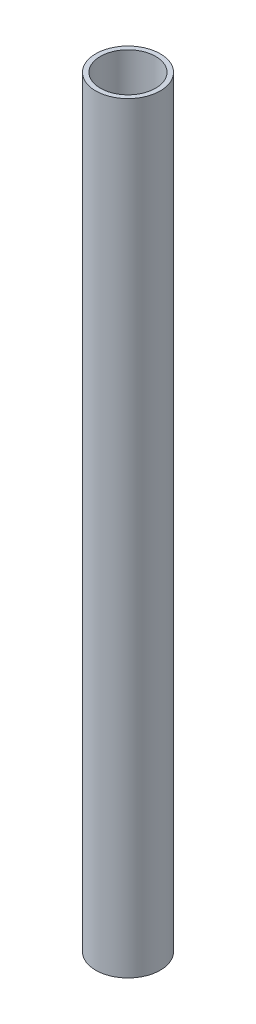
ISO-10303-21;
HEADER;
FILE_DESCRIPTION(('STEP AP214'),'2;1');
FILE_NAME('part.step','',(''),(''),'','','');
FILE_SCHEMA(('AUTOMOTIVE_DESIGN { 1 0 10303 214 1 1 1 1 }'));
ENDSEC;
DATA;
#1=APPLICATION_CONTEXT('core data for automotive mechanical design processes');
#2=APPLICATION_PROTOCOL_DEFINITION('international standard','automotive_design',2000,#1);
#3=PRODUCT_CONTEXT('',#1,'mechanical');
#4=PRODUCT('Part','Part','',(#3));
#5=PRODUCT_RELATED_PRODUCT_CATEGORY('part','',(#4));
#6=PRODUCT_DEFINITION_FORMATION('','',#4);
#7=PRODUCT_DEFINITION_CONTEXT('part definition',#1,'design');
#8=PRODUCT_DEFINITION('design','',#6,#7);
#9=PRODUCT_DEFINITION_SHAPE('','',#8);
#10=(LENGTH_UNIT() NAMED_UNIT(*) SI_UNIT(.MILLI.,.METRE.));
#11=(NAMED_UNIT(*) PLANE_ANGLE_UNIT() SI_UNIT($,.RADIAN.));
#12=(NAMED_UNIT(*) SI_UNIT($,.STERADIAN.) SOLID_ANGLE_UNIT());
#13=UNCERTAINTY_MEASURE_WITH_UNIT(LENGTH_MEASURE(1.E-05),#10,'distance_accuracy_value','');
#14=(GEOMETRIC_REPRESENTATION_CONTEXT(3) GLOBAL_UNCERTAINTY_ASSIGNED_CONTEXT((#13)) GLOBAL_UNIT_ASSIGNED_CONTEXT((#10,
#11,#12)) REPRESENTATION_CONTEXT('',''));
#15=CARTESIAN_POINT('',(0.,0.,0.));
#16=DIRECTION('',(0.,0.,1.));
#17=DIRECTION('',(1.,0.,0.));
#18=AXIS2_PLACEMENT_3D('',#15,#16,#17);
#19=CARTESIAN_POINT('',(0.,525.145,0.));
#20=DIRECTION('',(0.,1.,0.));
#21=DIRECTION('',(0.,0.,1.));
#22=AXIS2_PLACEMENT_3D('',#19,#20,#21);
#23=PLANE('',#22);
#24=CARTESIAN_POINT('',(0.,525.145,0.));
#25=DIRECTION('',(0.,1.,0.));
#26=DIRECTION('',(0.,0.,1.));
#27=AXIS2_PLACEMENT_3D('',#24,#25,#26);
#28=CIRCLE('',#27,44.45);
#29=CARTESIAN_POINT('',(0.,525.145,44.45));
#30=VERTEX_POINT('',#29);
#31=EDGE_CURVE('E10',#30,#30,#28,.T.);
#32=ORIENTED_EDGE('',*,*,#31,.T.);
#33=EDGE_LOOP('',(#32));
#34=FACE_BOUND('',#33,.T.);
#35=CARTESIAN_POINT('',(0.,525.145,0.));
#36=DIRECTION('',(0.,1.,0.));
#37=DIRECTION('',(0.,0.,1.));
#38=AXIS2_PLACEMENT_3D('',#35,#36,#37);
#39=CIRCLE('',#38,38.1);
#40=CARTESIAN_POINT('',(0.,525.145,38.1));
#41=VERTEX_POINT('',#40);
#42=EDGE_CURVE('E48',#41,#41,#39,.T.);
#43=ORIENTED_EDGE('',*,*,#42,.F.);
#44=EDGE_LOOP('',(#43));
#45=FACE_BOUND('',#44,.T.);
#46=ADVANCED_FACE('F37',(#34,#45),#23,.T.);
#47=CARTESIAN_POINT('',(0.,-525.145,0.));
#48=DIRECTION('',(0.,1.,0.));
#49=DIRECTION('',(0.,0.,1.));
#50=AXIS2_PLACEMENT_3D('',#47,#48,#49);
#51=PLANE('',#50);
#52=CARTESIAN_POINT('',(0.,-525.145,0.));
#53=DIRECTION('',(0.,1.,0.));
#54=DIRECTION('',(0.,0.,1.));
#55=AXIS2_PLACEMENT_3D('',#52,#53,#54);
#56=CIRCLE('',#55,44.45);
#57=CARTESIAN_POINT('',(0.,-525.145,44.45));
#58=VERTEX_POINT('',#57);
#59=EDGE_CURVE('E41',#58,#58,#56,.T.);
#60=ORIENTED_EDGE('',*,*,#59,.F.);
#61=EDGE_LOOP('',(#60));
#62=FACE_BOUND('',#61,.T.);
#63=CARTESIAN_POINT('',(0.,-525.145,0.));
#64=DIRECTION('',(0.,1.,0.));
#65=DIRECTION('',(0.,0.,1.));
#66=AXIS2_PLACEMENT_3D('',#63,#64,#65);
#67=CIRCLE('',#66,38.1);
#68=CARTESIAN_POINT('',(0.,-525.145,38.1));
#69=VERTEX_POINT('',#68);
#70=EDGE_CURVE('E50',#69,#69,#67,.T.);
#71=ORIENTED_EDGE('',*,*,#70,.T.);
#72=EDGE_LOOP('',(#71));
#73=FACE_BOUND('',#72,.T.);
#74=ADVANCED_FACE('F60',(#62,#73),#51,.F.);
#75=CARTESIAN_POINT('',(0.,525.145,0.));
#76=DIRECTION('',(0.,-1.,0.));
#77=DIRECTION('',(0.,0.,-1.));
#78=AXIS2_PLACEMENT_3D('',#75,#76,#77);
#79=CYLINDRICAL_SURFACE('',#78,44.45);
#80=ORIENTED_EDGE('',*,*,#31,.F.);
#81=EDGE_LOOP('',(#80));
#82=FACE_BOUND('',#81,.T.);
#83=ORIENTED_EDGE('',*,*,#59,.T.);
#84=EDGE_LOOP('',(#83));
#85=FACE_BOUND('',#84,.T.);
#86=ADVANCED_FACE('F39',(#82,#85),#79,.T.);
#87=CARTESIAN_POINT('',(0.,525.145,0.));
#88=DIRECTION('',(0.,-1.,0.));
#89=DIRECTION('',(0.,0.,-1.));
#90=AXIS2_PLACEMENT_3D('',#87,#88,#89);
#91=CYLINDRICAL_SURFACE('',#90,38.1);
#92=ORIENTED_EDGE('',*,*,#42,.T.);
#93=EDGE_LOOP('',(#92));
#94=FACE_BOUND('',#93,.T.);
#95=ORIENTED_EDGE('',*,*,#70,.F.);
#96=EDGE_LOOP('',(#95));
#97=FACE_BOUND('',#96,.T.);
#98=ADVANCED_FACE('F56',(#94,#97),#91,.F.);
#99=CLOSED_SHELL('',(#46,#74,#86,#98));
#100=MANIFOLD_SOLID_BREP('B2',#99);
#101=ADVANCED_BREP_SHAPE_REPRESENTATION('',(#18,#100),#14);
#102=SHAPE_DEFINITION_REPRESENTATION(#9,#101);
ENDSEC;
END-ISO-10303-21;
